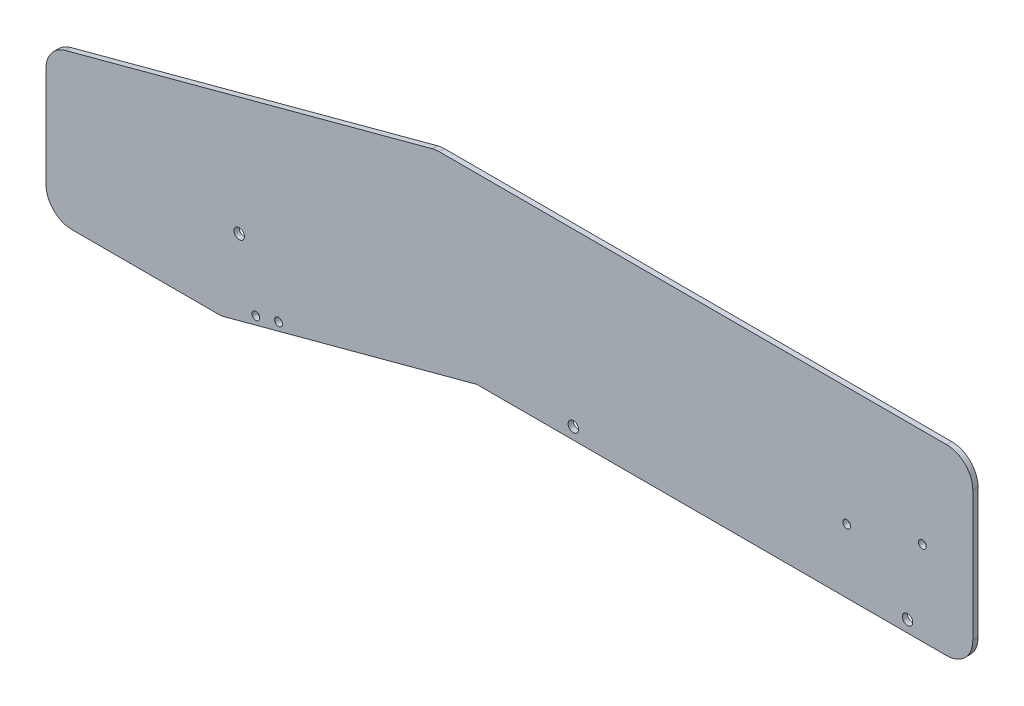
ISO-10303-21;
HEADER;
FILE_DESCRIPTION(('STEP AP214'),'2;1');
FILE_NAME('part.step','',(''),(''),'','','');
FILE_SCHEMA(('AUTOMOTIVE_DESIGN { 1 0 10303 214 1 1 1 1 }'));
ENDSEC;
DATA;
#1=APPLICATION_CONTEXT('core data for automotive mechanical design processes');
#2=APPLICATION_PROTOCOL_DEFINITION('international standard','automotive_design',2000,#1);
#3=PRODUCT_CONTEXT('',#1,'mechanical');
#4=PRODUCT('Part','Part','',(#3));
#5=PRODUCT_RELATED_PRODUCT_CATEGORY('part','',(#4));
#6=PRODUCT_DEFINITION_FORMATION('','',#4);
#7=PRODUCT_DEFINITION_CONTEXT('part definition',#1,'design');
#8=PRODUCT_DEFINITION('design','',#6,#7);
#9=PRODUCT_DEFINITION_SHAPE('','',#8);
#10=(LENGTH_UNIT() NAMED_UNIT(*) SI_UNIT(.MILLI.,.METRE.));
#11=(NAMED_UNIT(*) PLANE_ANGLE_UNIT() SI_UNIT($,.RADIAN.));
#12=(NAMED_UNIT(*) SI_UNIT($,.STERADIAN.) SOLID_ANGLE_UNIT());
#13=UNCERTAINTY_MEASURE_WITH_UNIT(LENGTH_MEASURE(1.E-05),#10,'distance_accuracy_value','');
#14=(GEOMETRIC_REPRESENTATION_CONTEXT(3) GLOBAL_UNCERTAINTY_ASSIGNED_CONTEXT((#13)) GLOBAL_UNIT_ASSIGNED_CONTEXT((#10,
#11,#12)) REPRESENTATION_CONTEXT('',''));
#15=CARTESIAN_POINT('',(0.,0.,0.));
#16=DIRECTION('',(0.,0.,1.));
#17=DIRECTION('',(1.,0.,0.));
#18=AXIS2_PLACEMENT_3D('',#15,#16,#17);
#19=CARTESIAN_POINT('',(-177.5,-35.,2.));
#20=DIRECTION('',(0.,1.,0.));
#21=DIRECTION('',(0.,0.,1.));
#22=AXIS2_PLACEMENT_3D('',#19,#20,#21);
#23=PLANE('',#22);
#24=DIRECTION('',(1.,0.,0.));
#25=VECTOR('',#24,1.);
#26=CARTESIAN_POINT('',(-177.5,-35.,0.));
#27=LINE('',#26,#25);
#28=CARTESIAN_POINT('',(-12.5,-35.,0.));
#29=VERTEX_POINT('',#28);
#30=CARTESIAN_POINT('',(167.5,-35.,0.));
#31=VERTEX_POINT('',#30);
#32=EDGE_CURVE('E173',#29,#31,#27,.T.);
#33=ORIENTED_EDGE('',*,*,#32,.T.);
#34=DIRECTION('',(0.,0.,-1.));
#35=VECTOR('',#34,1.);
#36=CARTESIAN_POINT('',(167.5,-35.,2.));
#37=LINE('',#36,#35);
#38=CARTESIAN_POINT('',(167.5,-35.,2.));
#39=VERTEX_POINT('',#38);
#40=EDGE_CURVE('E248',#31,#39,#37,.F.);
#41=ORIENTED_EDGE('',*,*,#40,.T.);
#42=DIRECTION('',(1.,0.,0.));
#43=VECTOR('',#42,1.);
#44=CARTESIAN_POINT('',(-177.5,-35.,2.));
#45=LINE('',#44,#43);
#46=CARTESIAN_POINT('',(-12.5,-35.,2.));
#47=VERTEX_POINT('',#46);
#48=EDGE_CURVE('E180',#47,#39,#45,.T.);
#49=ORIENTED_EDGE('',*,*,#48,.F.);
#50=DIRECTION('',(0.,0.,1.));
#51=VECTOR('',#50,1.);
#52=CARTESIAN_POINT('',(-12.5,-35.,-170.820569767663));
#53=LINE('',#52,#51);
#54=EDGE_CURVE('E154',#29,#47,#53,.T.);
#55=ORIENTED_EDGE('',*,*,#54,.F.);
#56=EDGE_LOOP('',(#33,#41,#49,#55));
#57=FACE_BOUND('',#56,.T.);
#58=ADVANCED_FACE('F39',(#57),#23,.F.);
#59=CARTESIAN_POINT('',(177.5,35.,2.));
#60=DIRECTION('',(-1.,0.,0.));
#61=DIRECTION('',(0.,0.,1.));
#62=AXIS2_PLACEMENT_3D('',#59,#60,#61);
#63=PLANE('',#62);
#64=DIRECTION('',(0.,1.,0.));
#65=VECTOR('',#64,1.);
#66=CARTESIAN_POINT('',(177.5,35.,0.));
#67=LINE('',#66,#65);
#68=CARTESIAN_POINT('',(177.5,-25.,0.));
#69=VERTEX_POINT('',#68);
#70=CARTESIAN_POINT('',(177.5,25.,0.));
#71=VERTEX_POINT('',#70);
#72=EDGE_CURVE('E184',#69,#71,#67,.T.);
#73=ORIENTED_EDGE('',*,*,#72,.T.);
#74=DIRECTION('',(0.,0.,-1.));
#75=VECTOR('',#74,1.);
#76=CARTESIAN_POINT('',(177.5,25.,2.));
#77=LINE('',#76,#75);
#78=CARTESIAN_POINT('',(177.5,25.,2.));
#79=VERTEX_POINT('',#78);
#80=EDGE_CURVE('E245',#71,#79,#77,.F.);
#81=ORIENTED_EDGE('',*,*,#80,.T.);
#82=DIRECTION('',(0.,1.,0.));
#83=VECTOR('',#82,1.);
#84=CARTESIAN_POINT('',(177.5,35.,2.));
#85=LINE('',#84,#83);
#86=CARTESIAN_POINT('',(177.5,-25.,2.));
#87=VERTEX_POINT('',#86);
#88=EDGE_CURVE('E168',#87,#79,#85,.T.);
#89=ORIENTED_EDGE('',*,*,#88,.F.);
#90=DIRECTION('',(0.,0.,-1.));
#91=VECTOR('',#90,1.);
#92=CARTESIAN_POINT('',(177.5,-25.,2.));
#93=LINE('',#92,#91);
#94=EDGE_CURVE('E241',#87,#69,#93,.T.);
#95=ORIENTED_EDGE('',*,*,#94,.T.);
#96=EDGE_LOOP('',(#73,#81,#89,#95));
#97=FACE_BOUND('',#96,.T.);
#98=ADVANCED_FACE('F280',(#97),#63,.F.);
#99=CARTESIAN_POINT('',(-177.5,35.,2.));
#100=DIRECTION('',(0.,-1.,0.));
#101=DIRECTION('',(0.,0.,-1.));
#102=AXIS2_PLACEMENT_3D('',#99,#100,#101);
#103=PLANE('',#102);
#104=DIRECTION('',(-1.,0.,0.));
#105=VECTOR('',#104,1.);
#106=CARTESIAN_POINT('',(-177.5,35.,2.));
#107=LINE('',#106,#105);
#108=CARTESIAN_POINT('',(167.5,35.,2.));
#109=VERTEX_POINT('',#108);
#110=CARTESIAN_POINT('',(-26.9014427213671,35.,2.));
#111=VERTEX_POINT('',#110);
#112=EDGE_CURVE('E172',#109,#111,#107,.T.);
#113=ORIENTED_EDGE('',*,*,#112,.F.);
#114=DIRECTION('',(0.,0.,-1.));
#115=VECTOR('',#114,1.);
#116=CARTESIAN_POINT('',(167.5,35.,2.));
#117=LINE('',#116,#115);
#118=CARTESIAN_POINT('',(167.5,35.,0.));
#119=VERTEX_POINT('',#118);
#120=EDGE_CURVE('E237',#109,#119,#117,.T.);
#121=ORIENTED_EDGE('',*,*,#120,.T.);
#122=DIRECTION('',(-1.,0.,0.));
#123=VECTOR('',#122,1.);
#124=CARTESIAN_POINT('',(-177.5,35.,0.));
#125=LINE('',#124,#123);
#126=CARTESIAN_POINT('',(-26.9014427213671,35.,0.));
#127=VERTEX_POINT('',#126);
#128=EDGE_CURVE('E187',#119,#127,#125,.T.);
#129=ORIENTED_EDGE('',*,*,#128,.T.);
#130=DIRECTION('',(0.,0.,1.));
#131=VECTOR('',#130,1.);
#132=CARTESIAN_POINT('',(-26.9014427213671,35.,2.));
#133=LINE('',#132,#131);
#134=EDGE_CURVE('E233',#127,#111,#133,.T.);
#135=ORIENTED_EDGE('',*,*,#134,.T.);
#136=EDGE_LOOP('',(#113,#121,#129,#135));
#137=FACE_BOUND('',#136,.T.);
#138=ADVANCED_FACE('F272',(#137),#103,.F.);
#139=CARTESIAN_POINT('',(-177.5,35.,2.));
#140=DIRECTION('',(1.,0.,0.));
#141=DIRECTION('',(0.,0.,-1.));
#142=AXIS2_PLACEMENT_3D('',#139,#140,#141);
#143=PLANE('',#142);
#144=DIRECTION('',(0.,-1.,0.));
#145=VECTOR('',#144,1.);
#146=CARTESIAN_POINT('',(-177.5,35.,0.));
#147=LINE('',#146,#145);
#148=CARTESIAN_POINT('',(-177.5,-12.6732698797897,0.));
#149=VERTEX_POINT('',#148);
#150=CARTESIAN_POINT('',(-177.5,-51.2116167511341,0.));
#151=VERTEX_POINT('',#150);
#152=EDGE_CURVE('E191',#149,#151,#147,.T.);
#153=ORIENTED_EDGE('',*,*,#152,.T.);
#154=DIRECTION('',(0.,0.,1.));
#155=VECTOR('',#154,1.);
#156=CARTESIAN_POINT('',(-177.5,-51.2116167511341,2.));
#157=LINE('',#156,#155);
#158=CARTESIAN_POINT('',(-177.5,-51.2116167511341,2.));
#159=VERTEX_POINT('',#158);
#160=EDGE_CURVE('E199',#151,#159,#157,.T.);
#161=ORIENTED_EDGE('',*,*,#160,.T.);
#162=DIRECTION('',(0.,-1.,0.));
#163=VECTOR('',#162,1.);
#164=CARTESIAN_POINT('',(-177.5,35.,2.));
#165=LINE('',#164,#163);
#166=CARTESIAN_POINT('',(-177.5,-12.6732698797897,2.));
#167=VERTEX_POINT('',#166);
#168=EDGE_CURVE('E177',#167,#159,#165,.T.);
#169=ORIENTED_EDGE('',*,*,#168,.F.);
#170=DIRECTION('',(0.,0.,1.));
#171=VECTOR('',#170,1.);
#172=CARTESIAN_POINT('',(-177.5,-12.6732698797897,2.));
#173=LINE('',#172,#171);
#174=EDGE_CURVE('E183',#167,#149,#173,.F.);
#175=ORIENTED_EDGE('',*,*,#174,.T.);
#176=EDGE_LOOP('',(#153,#161,#169,#175));
#177=FACE_BOUND('',#176,.T.);
#178=ADVANCED_FACE('F296',(#177),#143,.F.);
#179=CARTESIAN_POINT('',(0.,0.,2.));
#180=DIRECTION('',(0.,0.,1.));
#181=DIRECTION('',(1.,0.,0.));
#182=AXIS2_PLACEMENT_3D('',#179,#180,#181);
#183=PLANE('',#182);
#184=ORIENTED_EDGE('',*,*,#168,.T.);
#185=CARTESIAN_POINT('',(-167.5,-51.2116167511341,2.));
#186=DIRECTION('',(0.,0.,1.));
#187=DIRECTION('',(1.,0.,0.));
#188=AXIS2_PLACEMENT_3D('',#185,#186,#187);
#189=CIRCLE('',#188,10.);
#190=CARTESIAN_POINT('',(-167.5,-61.2116167511341,2.));
#191=VERTEX_POINT('',#190);
#192=EDGE_CURVE('E149',#159,#191,#189,.T.);
#193=ORIENTED_EDGE('',*,*,#192,.T.);
#194=DIRECTION('',(-1.,0.,0.));
#195=VECTOR('',#194,1.);
#196=CARTESIAN_POINT('',(-110.323085463758,-61.2116167511341,2.));
#197=LINE('',#196,#195);
#198=CARTESIAN_POINT('',(-110.323085463758,-61.2116167511341,2.));
#199=VERTEX_POINT('',#198);
#200=EDGE_CURVE('E132',#199,#191,#197,.T.);
#201=ORIENTED_EDGE('',*,*,#200,.F.);
#202=DIRECTION('',(0.96592582628907,0.258819045102515,0.));
#203=VECTOR('',#202,1.);
#204=CARTESIAN_POINT('',(-12.5,-35.,2.));
#205=LINE('',#204,#203);
#206=EDGE_CURVE('E147',#199,#47,#205,.T.);
#207=ORIENTED_EDGE('',*,*,#206,.T.);
#208=ORIENTED_EDGE('',*,*,#48,.T.);
#209=CARTESIAN_POINT('',(167.5,-25.,2.));
#210=DIRECTION('',(0.,0.,1.));
#211=DIRECTION('',(1.,0.,0.));
#212=AXIS2_PLACEMENT_3D('',#209,#210,#211);
#213=CIRCLE('',#212,10.);
#214=EDGE_CURVE('E209',#39,#87,#213,.T.);
#215=ORIENTED_EDGE('',*,*,#214,.T.);
#216=ORIENTED_EDGE('',*,*,#88,.T.);
#217=CARTESIAN_POINT('',(167.5,25.,2.));
#218=DIRECTION('',(0.,0.,1.));
#219=DIRECTION('',(1.,0.,0.));
#220=AXIS2_PLACEMENT_3D('',#217,#218,#219);
#221=CIRCLE('',#220,10.);
#222=EDGE_CURVE('E212',#79,#109,#221,.T.);
#223=ORIENTED_EDGE('',*,*,#222,.T.);
#224=ORIENTED_EDGE('',*,*,#112,.T.);
#225=CARTESIAN_POINT('',(-26.9014427213671,25.,2.));
#226=DIRECTION('',(0.,0.,1.));
#227=DIRECTION('',(1.,0.,0.));
#228=AXIS2_PLACEMENT_3D('',#225,#226,#227);
#229=CIRCLE('',#228,10.);
#230=CARTESIAN_POINT('',(-29.4896331723923,34.6592582628907,2.));
#231=VERTEX_POINT('',#230);
#232=EDGE_CURVE('E203',#111,#231,#229,.T.);
#233=ORIENTED_EDGE('',*,*,#232,.T.);
#234=DIRECTION('',(0.96592582628907,0.258819045102515,0.));
#235=VECTOR('',#234,1.);
#236=CARTESIAN_POINT('',(-177.5,-5.,2.));
#237=LINE('',#236,#235);
#238=CARTESIAN_POINT('',(-170.088190451025,-3.01401161689895,2.));
#239=VERTEX_POINT('',#238);
#240=EDGE_CURVE('E260',#239,#231,#237,.T.);
#241=ORIENTED_EDGE('',*,*,#240,.F.);
#242=CARTESIAN_POINT('',(-167.5,-12.6732698797897,2.));
#243=DIRECTION('',(0.,0.,1.));
#244=DIRECTION('',(1.,0.,0.));
#245=AXIS2_PLACEMENT_3D('',#242,#243,#244);
#246=CIRCLE('',#245,10.);
#247=EDGE_CURVE('E206',#239,#167,#246,.T.);
#248=ORIENTED_EDGE('',*,*,#247,.T.);
#249=EDGE_LOOP('',(#184,#193,#201,#207,#208,#215,#216,#223,#224,#233,#241,#248));
#250=FACE_BOUND('',#249,.T.);
#251=CARTESIAN_POINT('',(-97.1275124741684,-54.570045083678,2.));
#252=DIRECTION('',(0.,0.,1.));
#253=DIRECTION('',(1.,0.,0.));
#254=AXIS2_PLACEMENT_3D('',#251,#252,#253);
#255=CIRCLE('',#254,1.5);
#256=CARTESIAN_POINT('',(-95.6275124741684,-54.570045083678,2.));
#257=VERTEX_POINT('',#256);
#258=EDGE_CURVE('E547',#257,#257,#255,.T.);
#259=ORIENTED_EDGE('',*,*,#258,.F.);
#260=EDGE_LOOP('',(#259));
#261=FACE_BOUND('',#260,.T.);
#262=CARTESIAN_POINT('',(-88.4341800375668,-52.2406736777553,2.));
#263=DIRECTION('',(0.,0.,1.));
#264=DIRECTION('',(1.,0.,0.));
#265=AXIS2_PLACEMENT_3D('',#262,#263,#264);
#266=CIRCLE('',#265,1.5);
#267=CARTESIAN_POINT('',(-86.9341800375668,-52.2406736777553,2.));
#268=VERTEX_POINT('',#267);
#269=EDGE_CURVE('E543',#268,#268,#266,.T.);
#270=ORIENTED_EDGE('',*,*,#269,.F.);
#271=EDGE_LOOP('',(#270));
#272=FACE_BOUND('',#271,.T.);
#273=CARTESIAN_POINT('',(129.203708685547,-10.4891960385437,2.));
#274=DIRECTION('',(0.,0.,1.));
#275=DIRECTION('',(1.,0.,0.));
#276=AXIS2_PLACEMENT_3D('',#273,#274,#275);
#277=CIRCLE('',#276,1.49999999999962);
#278=CARTESIAN_POINT('',(130.703708685546,-10.4891960385437,2.));
#279=VERTEX_POINT('',#278);
#280=EDGE_CURVE('E537',#279,#279,#277,.T.);
#281=ORIENTED_EDGE('',*,*,#280,.F.);
#282=EDGE_LOOP('',(#281));
#283=FACE_BOUND('',#282,.T.);
#284=CARTESIAN_POINT('',(158.181483474219,-2.72462468546804,2.));
#285=DIRECTION('',(0.,0.,1.));
#286=DIRECTION('',(1.,0.,0.));
#287=AXIS2_PLACEMENT_3D('',#284,#285,#286);
#288=CIRCLE('',#287,1.49999999999962);
#289=CARTESIAN_POINT('',(159.681483474218,-2.72462468546804,2.));
#290=VERTEX_POINT('',#289);
#291=EDGE_CURVE('E531',#290,#290,#288,.T.);
#292=ORIENTED_EDGE('',*,*,#291,.F.);
#293=EDGE_LOOP('',(#292));
#294=FACE_BOUND('',#293,.T.);
#295=CARTESIAN_POINT('',(152.5,-30.5,2.));
#296=DIRECTION('',(0.,0.,1.));
#297=DIRECTION('',(1.,0.,0.));
#298=AXIS2_PLACEMENT_3D('',#295,#296,#297);
#299=CIRCLE('',#298,2.);
#300=CARTESIAN_POINT('',(154.5,-30.5,2.));
#301=VERTEX_POINT('',#300);
#302=EDGE_CURVE('E163',#301,#301,#299,.T.);
#303=ORIENTED_EDGE('',*,*,#302,.F.);
#304=EDGE_LOOP('',(#303));
#305=FACE_BOUND('',#304,.T.);
#306=CARTESIAN_POINT('',(24.5,-30.5,2.));
#307=DIRECTION('',(0.,0.,1.));
#308=DIRECTION('',(1.,0.,0.));
#309=AXIS2_PLACEMENT_3D('',#306,#307,#308);
#310=CIRCLE('',#309,2.);
#311=CARTESIAN_POINT('',(26.5,-30.5,2.));
#312=VERTEX_POINT('',#311);
#313=EDGE_CURVE('E515',#312,#312,#310,.T.);
#314=ORIENTED_EDGE('',*,*,#313,.F.);
#315=EDGE_LOOP('',(#314));
#316=FACE_BOUND('',#315,.T.);
#317=CARTESIAN_POINT('',(-103.5,-30.5,2.));
#318=DIRECTION('',(0.,0.,1.));
#319=DIRECTION('',(1.,0.,0.));
#320=AXIS2_PLACEMENT_3D('',#317,#318,#319);
#321=CIRCLE('',#320,2.);
#322=CARTESIAN_POINT('',(-101.5,-30.5,2.));
#323=VERTEX_POINT('',#322);
#324=EDGE_CURVE('E516',#323,#323,#321,.T.);
#325=ORIENTED_EDGE('',*,*,#324,.F.);
#326=EDGE_LOOP('',(#325));
#327=FACE_BOUND('',#326,.T.);
#328=ADVANCED_FACE('F144',(#250,#261,#272,#283,#294,#305,#316,#327),#183,.T.);
#329=CARTESIAN_POINT('',(0.,0.,0.));
#330=DIRECTION('',(0.,0.,1.));
#331=DIRECTION('',(1.,0.,0.));
#332=AXIS2_PLACEMENT_3D('',#329,#330,#331);
#333=PLANE('',#332);
#334=CARTESIAN_POINT('',(-97.1275124741684,-54.570045083678,0.));
#335=DIRECTION('',(0.,0.,1.));
#336=DIRECTION('',(1.,0.,0.));
#337=AXIS2_PLACEMENT_3D('',#334,#335,#336);
#338=CIRCLE('',#337,1.5);
#339=CARTESIAN_POINT('',(-95.6275124741684,-54.570045083678,0.));
#340=VERTEX_POINT('',#339);
#341=EDGE_CURVE('E493',#340,#340,#338,.T.);
#342=ORIENTED_EDGE('',*,*,#341,.T.);
#343=EDGE_LOOP('',(#342));
#344=FACE_BOUND('',#343,.T.);
#345=CARTESIAN_POINT('',(-88.4341800375668,-52.2406736777553,0.));
#346=DIRECTION('',(0.,0.,1.));
#347=DIRECTION('',(1.,0.,0.));
#348=AXIS2_PLACEMENT_3D('',#345,#346,#347);
#349=CIRCLE('',#348,1.5);
#350=CARTESIAN_POINT('',(-86.9341800375668,-52.2406736777553,0.));
#351=VERTEX_POINT('',#350);
#352=EDGE_CURVE('E497',#351,#351,#349,.T.);
#353=ORIENTED_EDGE('',*,*,#352,.T.);
#354=EDGE_LOOP('',(#353));
#355=FACE_BOUND('',#354,.T.);
#356=CARTESIAN_POINT('',(129.203708685547,-10.4891960385437,0.));
#357=DIRECTION('',(0.,0.,1.));
#358=DIRECTION('',(1.,0.,0.));
#359=AXIS2_PLACEMENT_3D('',#356,#357,#358);
#360=CIRCLE('',#359,1.49999999999962);
#361=CARTESIAN_POINT('',(130.703708685546,-10.4891960385437,0.));
#362=VERTEX_POINT('',#361);
#363=EDGE_CURVE('E501',#362,#362,#360,.T.);
#364=ORIENTED_EDGE('',*,*,#363,.T.);
#365=EDGE_LOOP('',(#364));
#366=FACE_BOUND('',#365,.T.);
#367=CARTESIAN_POINT('',(158.181483474219,-2.72462468546804,0.));
#368=DIRECTION('',(0.,0.,1.));
#369=DIRECTION('',(1.,0.,0.));
#370=AXIS2_PLACEMENT_3D('',#367,#368,#369);
#371=CIRCLE('',#370,1.49999999999962);
#372=CARTESIAN_POINT('',(159.681483474218,-2.72462468546804,0.));
#373=VERTEX_POINT('',#372);
#374=EDGE_CURVE('E267',#373,#373,#371,.T.);
#375=ORIENTED_EDGE('',*,*,#374,.T.);
#376=EDGE_LOOP('',(#375));
#377=FACE_BOUND('',#376,.T.);
#378=CARTESIAN_POINT('',(152.5,-30.5,0.));
#379=DIRECTION('',(0.,0.,1.));
#380=DIRECTION('',(1.,0.,0.));
#381=AXIS2_PLACEMENT_3D('',#378,#379,#380);
#382=CIRCLE('',#381,2.);
#383=CARTESIAN_POINT('',(154.5,-30.5,0.));
#384=VERTEX_POINT('',#383);
#385=EDGE_CURVE('E156',#384,#384,#382,.T.);
#386=ORIENTED_EDGE('',*,*,#385,.T.);
#387=EDGE_LOOP('',(#386));
#388=FACE_BOUND('',#387,.T.);
#389=CARTESIAN_POINT('',(24.5,-30.5,0.));
#390=DIRECTION('',(0.,0.,1.));
#391=DIRECTION('',(1.,0.,0.));
#392=AXIS2_PLACEMENT_3D('',#389,#390,#391);
#393=CIRCLE('',#392,2.);
#394=CARTESIAN_POINT('',(26.5,-30.5,0.));
#395=VERTEX_POINT('',#394);
#396=EDGE_CURVE('E510',#395,#395,#393,.T.);
#397=ORIENTED_EDGE('',*,*,#396,.T.);
#398=EDGE_LOOP('',(#397));
#399=FACE_BOUND('',#398,.T.);
#400=CARTESIAN_POINT('',(-103.5,-30.5,0.));
#401=DIRECTION('',(0.,0.,1.));
#402=DIRECTION('',(1.,0.,0.));
#403=AXIS2_PLACEMENT_3D('',#400,#401,#402);
#404=CIRCLE('',#403,2.);
#405=CARTESIAN_POINT('',(-101.5,-30.5,0.));
#406=VERTEX_POINT('',#405);
#407=EDGE_CURVE('E513',#406,#406,#404,.T.);
#408=ORIENTED_EDGE('',*,*,#407,.T.);
#409=EDGE_LOOP('',(#408));
#410=FACE_BOUND('',#409,.T.);
#411=DIRECTION('',(1.,0.,0.));
#412=VECTOR('',#411,1.);
#413=CARTESIAN_POINT('',(-110.323085463758,-61.2116167511341,0.));
#414=LINE('',#413,#412);
#415=CARTESIAN_POINT('',(-167.5,-61.2116167511341,0.));
#416=VERTEX_POINT('',#415);
#417=CARTESIAN_POINT('',(-110.323085463758,-61.2116167511341,0.));
#418=VERTEX_POINT('',#417);
#419=EDGE_CURVE('E135',#416,#418,#414,.T.);
#420=ORIENTED_EDGE('',*,*,#419,.F.);
#421=CARTESIAN_POINT('',(-167.5,-51.2116167511341,0.));
#422=DIRECTION('',(0.,0.,1.));
#423=DIRECTION('',(1.,0.,0.));
#424=AXIS2_PLACEMENT_3D('',#421,#422,#423);
#425=CIRCLE('',#424,10.);
#426=EDGE_CURVE('E230',#416,#151,#425,.F.);
#427=ORIENTED_EDGE('',*,*,#426,.T.);
#428=ORIENTED_EDGE('',*,*,#152,.F.);
#429=CARTESIAN_POINT('',(-167.5,-12.6732698797897,0.));
#430=DIRECTION('',(0.,0.,1.));
#431=DIRECTION('',(1.,0.,0.));
#432=AXIS2_PLACEMENT_3D('',#429,#430,#431);
#433=CIRCLE('',#432,10.);
#434=CARTESIAN_POINT('',(-170.088190451025,-3.01401161689895,0.));
#435=VERTEX_POINT('',#434);
#436=EDGE_CURVE('E223',#149,#435,#433,.F.);
#437=ORIENTED_EDGE('',*,*,#436,.T.);
#438=DIRECTION('',(-0.96592582628907,-0.258819045102515,0.));
#439=VECTOR('',#438,1.);
#440=CARTESIAN_POINT('',(-177.5,-5.,0.));
#441=LINE('',#440,#439);
#442=CARTESIAN_POINT('',(-29.4896331723923,34.6592582628907,0.));
#443=VERTEX_POINT('',#442);
#444=EDGE_CURVE('E257',#443,#435,#441,.T.);
#445=ORIENTED_EDGE('',*,*,#444,.F.);
#446=CARTESIAN_POINT('',(-26.9014427213671,25.,0.));
#447=DIRECTION('',(0.,0.,1.));
#448=DIRECTION('',(1.,0.,0.));
#449=AXIS2_PLACEMENT_3D('',#446,#447,#448);
#450=CIRCLE('',#449,10.);
#451=EDGE_CURVE('E220',#443,#127,#450,.F.);
#452=ORIENTED_EDGE('',*,*,#451,.T.);
#453=ORIENTED_EDGE('',*,*,#128,.F.);
#454=CARTESIAN_POINT('',(167.5,25.,0.));
#455=DIRECTION('',(0.,0.,1.));
#456=DIRECTION('',(1.,0.,0.));
#457=AXIS2_PLACEMENT_3D('',#454,#455,#456);
#458=CIRCLE('',#457,10.);
#459=EDGE_CURVE('E61',#119,#71,#458,.F.);
#460=ORIENTED_EDGE('',*,*,#459,.T.);
#461=ORIENTED_EDGE('',*,*,#72,.F.);
#462=CARTESIAN_POINT('',(167.5,-25.,0.));
#463=DIRECTION('',(0.,0.,1.));
#464=DIRECTION('',(1.,0.,0.));
#465=AXIS2_PLACEMENT_3D('',#462,#463,#464);
#466=CIRCLE('',#465,10.);
#467=EDGE_CURVE('E55',#69,#31,#466,.F.);
#468=ORIENTED_EDGE('',*,*,#467,.T.);
#469=ORIENTED_EDGE('',*,*,#32,.F.);
#470=DIRECTION('',(-0.96592582628907,-0.258819045102515,0.));
#471=VECTOR('',#470,1.);
#472=CARTESIAN_POINT('',(-12.5,-35.,0.));
#473=LINE('',#472,#471);
#474=EDGE_CURVE('E160',#29,#418,#473,.T.);
#475=ORIENTED_EDGE('',*,*,#474,.T.);
#476=EDGE_LOOP('',(#420,#427,#428,#437,#445,#452,#453,#460,#461,#468,#469,#475));
#477=FACE_BOUND('',#476,.T.);
#478=ADVANCED_FACE('F263',(#344,#355,#366,#377,#388,#399,#410,#477),#333,.F.);
#479=CARTESIAN_POINT('',(-12.5,-35.,-170.820569767663));
#480=DIRECTION('',(0.258819045102515,-0.96592582628907,0.));
#481=DIRECTION('',(0.96592582628907,0.258819045102515,0.));
#482=AXIS2_PLACEMENT_3D('',#479,#480,#481);
#483=PLANE('',#482);
#484=DIRECTION('',(0.,0.,1.));
#485=VECTOR('',#484,1.);
#486=CARTESIAN_POINT('',(-110.323085463758,-61.2116167511341,-69.5466594928146));
#487=LINE('',#486,#485);
#488=EDGE_CURVE('E129',#418,#199,#487,.T.);
#489=ORIENTED_EDGE('',*,*,#488,.F.);
#490=ORIENTED_EDGE('',*,*,#474,.F.);
#491=ORIENTED_EDGE('',*,*,#54,.T.);
#492=ORIENTED_EDGE('',*,*,#206,.F.);
#493=EDGE_LOOP('',(#489,#490,#491,#492));
#494=FACE_BOUND('',#493,.T.);
#495=ADVANCED_FACE('F153',(#494),#483,.T.);
#496=CARTESIAN_POINT('',(-103.5,-30.5,0.));
#497=DIRECTION('',(0.,0.,1.));
#498=DIRECTION('',(1.,0.,0.));
#499=AXIS2_PLACEMENT_3D('',#496,#497,#498);
#500=CYLINDRICAL_SURFACE('',#499,2.);
#501=ORIENTED_EDGE('',*,*,#407,.F.);
#502=EDGE_LOOP('',(#501));
#503=FACE_BOUND('',#502,.T.);
#504=ORIENTED_EDGE('',*,*,#324,.T.);
#505=EDGE_LOOP('',(#504));
#506=FACE_BOUND('',#505,.T.);
#507=ADVANCED_FACE('F418',(#503,#506),#500,.F.);
#508=CARTESIAN_POINT('',(24.5,-30.5,0.));
#509=DIRECTION('',(0.,0.,1.));
#510=DIRECTION('',(1.,0.,0.));
#511=AXIS2_PLACEMENT_3D('',#508,#509,#510);
#512=CYLINDRICAL_SURFACE('',#511,2.);
#513=ORIENTED_EDGE('',*,*,#396,.F.);
#514=EDGE_LOOP('',(#513));
#515=FACE_BOUND('',#514,.T.);
#516=ORIENTED_EDGE('',*,*,#313,.T.);
#517=EDGE_LOOP('',(#516));
#518=FACE_BOUND('',#517,.T.);
#519=ADVANCED_FACE('F409',(#515,#518),#512,.F.);
#520=CARTESIAN_POINT('',(152.5,-30.5,0.));
#521=DIRECTION('',(0.,0.,1.));
#522=DIRECTION('',(1.,0.,0.));
#523=AXIS2_PLACEMENT_3D('',#520,#521,#522);
#524=CYLINDRICAL_SURFACE('',#523,2.);
#525=ORIENTED_EDGE('',*,*,#385,.F.);
#526=EDGE_LOOP('',(#525));
#527=FACE_BOUND('',#526,.T.);
#528=ORIENTED_EDGE('',*,*,#302,.T.);
#529=EDGE_LOOP('',(#528));
#530=FACE_BOUND('',#529,.T.);
#531=ADVANCED_FACE('F400',(#527,#530),#524,.F.);
#532=CARTESIAN_POINT('',(158.181483474219,-2.72462468546804,0.));
#533=DIRECTION('',(0.,0.,1.));
#534=DIRECTION('',(1.,0.,0.));
#535=AXIS2_PLACEMENT_3D('',#532,#533,#534);
#536=CYLINDRICAL_SURFACE('',#535,1.49999999999962);
#537=ORIENTED_EDGE('',*,*,#374,.F.);
#538=EDGE_LOOP('',(#537));
#539=FACE_BOUND('',#538,.T.);
#540=ORIENTED_EDGE('',*,*,#291,.T.);
#541=EDGE_LOOP('',(#540));
#542=FACE_BOUND('',#541,.T.);
#543=ADVANCED_FACE('F391',(#539,#542),#536,.F.);
#544=CARTESIAN_POINT('',(129.203708685547,-10.4891960385437,0.));
#545=DIRECTION('',(0.,0.,1.));
#546=DIRECTION('',(1.,0.,0.));
#547=AXIS2_PLACEMENT_3D('',#544,#545,#546);
#548=CYLINDRICAL_SURFACE('',#547,1.49999999999962);
#549=ORIENTED_EDGE('',*,*,#363,.F.);
#550=EDGE_LOOP('',(#549));
#551=FACE_BOUND('',#550,.T.);
#552=ORIENTED_EDGE('',*,*,#280,.T.);
#553=EDGE_LOOP('',(#552));
#554=FACE_BOUND('',#553,.T.);
#555=ADVANCED_FACE('F382',(#551,#554),#548,.F.);
#556=CARTESIAN_POINT('',(-88.4341800375668,-52.2406736777553,0.));
#557=DIRECTION('',(0.,0.,1.));
#558=DIRECTION('',(1.,0.,0.));
#559=AXIS2_PLACEMENT_3D('',#556,#557,#558);
#560=CYLINDRICAL_SURFACE('',#559,1.5);
#561=ORIENTED_EDGE('',*,*,#352,.F.);
#562=EDGE_LOOP('',(#561));
#563=FACE_BOUND('',#562,.T.);
#564=ORIENTED_EDGE('',*,*,#269,.T.);
#565=EDGE_LOOP('',(#564));
#566=FACE_BOUND('',#565,.T.);
#567=ADVANCED_FACE('F372',(#563,#566),#560,.F.);
#568=CARTESIAN_POINT('',(-97.1275124741684,-54.570045083678,0.));
#569=DIRECTION('',(0.,0.,1.));
#570=DIRECTION('',(1.,0.,0.));
#571=AXIS2_PLACEMENT_3D('',#568,#569,#570);
#572=CYLINDRICAL_SURFACE('',#571,1.5);
#573=ORIENTED_EDGE('',*,*,#341,.F.);
#574=EDGE_LOOP('',(#573));
#575=FACE_BOUND('',#574,.T.);
#576=ORIENTED_EDGE('',*,*,#258,.T.);
#577=EDGE_LOOP('',(#576));
#578=FACE_BOUND('',#577,.T.);
#579=ADVANCED_FACE('F363',(#575,#578),#572,.F.);
#580=CARTESIAN_POINT('',(-177.5,-5.,-154.548132206255));
#581=DIRECTION('',(0.258819045102515,-0.96592582628907,0.));
#582=DIRECTION('',(0.96592582628907,0.258819045102515,0.));
#583=AXIS2_PLACEMENT_3D('',#580,#581,#582);
#584=PLANE('',#583);
#585=ORIENTED_EDGE('',*,*,#444,.T.);
#586=DIRECTION('',(0.,0.,1.));
#587=VECTOR('',#586,1.);
#588=CARTESIAN_POINT('',(-170.088190451025,-3.01401161689895,-154.548132206255));
#589=LINE('',#588,#587);
#590=EDGE_CURVE('E11',#435,#239,#589,.T.);
#591=ORIENTED_EDGE('',*,*,#590,.T.);
#592=ORIENTED_EDGE('',*,*,#240,.T.);
#593=DIRECTION('',(0.,0.,1.));
#594=VECTOR('',#593,1.);
#595=CARTESIAN_POINT('',(-29.4896331723923,34.6592582628907,-154.548132206255));
#596=LINE('',#595,#594);
#597=EDGE_CURVE('E48',#231,#443,#596,.F.);
#598=ORIENTED_EDGE('',*,*,#597,.T.);
#599=EDGE_LOOP('',(#585,#591,#592,#598));
#600=FACE_BOUND('',#599,.T.);
#601=ADVANCED_FACE('F256',(#600),#584,.F.);
#602=CARTESIAN_POINT('',(-110.323085463758,-61.2116167511341,-69.5466594928146));
#603=DIRECTION('',(0.,1.,0.));
#604=DIRECTION('',(-1.,0.,0.));
#605=AXIS2_PLACEMENT_3D('',#602,#603,#604);
#606=PLANE('',#605);
#607=ORIENTED_EDGE('',*,*,#200,.T.);
#608=DIRECTION('',(0.,0.,1.));
#609=VECTOR('',#608,1.);
#610=CARTESIAN_POINT('',(-167.5,-61.2116167511341,-69.5466594928146));
#611=LINE('',#610,#609);
#612=EDGE_CURVE('E217',#191,#416,#611,.F.);
#613=ORIENTED_EDGE('',*,*,#612,.T.);
#614=ORIENTED_EDGE('',*,*,#419,.T.);
#615=ORIENTED_EDGE('',*,*,#488,.T.);
#616=EDGE_LOOP('',(#607,#613,#614,#615));
#617=FACE_BOUND('',#616,.T.);
#618=ADVANCED_FACE('F131',(#617),#606,.F.);
#619=CARTESIAN_POINT('',(-167.5,-51.2116167511341,2.));
#620=DIRECTION('',(0.,0.,1.));
#621=DIRECTION('',(1.,0.,0.));
#622=AXIS2_PLACEMENT_3D('',#619,#620,#621);
#623=CYLINDRICAL_SURFACE('',#622,10.);
#624=ORIENTED_EDGE('',*,*,#426,.F.);
#625=ORIENTED_EDGE('',*,*,#612,.F.);
#626=ORIENTED_EDGE('',*,*,#192,.F.);
#627=ORIENTED_EDGE('',*,*,#160,.F.);
#628=EDGE_LOOP('',(#624,#625,#626,#627));
#629=FACE_BOUND('',#628,.T.);
#630=ADVANCED_FACE('F293',(#629),#623,.T.);
#631=CARTESIAN_POINT('',(167.5,25.,2.));
#632=DIRECTION('',(0.,0.,-1.));
#633=DIRECTION('',(-1.,0.,0.));
#634=AXIS2_PLACEMENT_3D('',#631,#632,#633);
#635=CYLINDRICAL_SURFACE('',#634,10.);
#636=ORIENTED_EDGE('',*,*,#222,.F.);
#637=ORIENTED_EDGE('',*,*,#80,.F.);
#638=ORIENTED_EDGE('',*,*,#459,.F.);
#639=ORIENTED_EDGE('',*,*,#120,.F.);
#640=EDGE_LOOP('',(#636,#637,#638,#639));
#641=FACE_BOUND('',#640,.T.);
#642=ADVANCED_FACE('F278',(#641),#635,.T.);
#643=CARTESIAN_POINT('',(167.5,-25.,2.));
#644=DIRECTION('',(0.,0.,-1.));
#645=DIRECTION('',(-1.,0.,0.));
#646=AXIS2_PLACEMENT_3D('',#643,#644,#645);
#647=CYLINDRICAL_SURFACE('',#646,10.);
#648=ORIENTED_EDGE('',*,*,#214,.F.);
#649=ORIENTED_EDGE('',*,*,#40,.F.);
#650=ORIENTED_EDGE('',*,*,#467,.F.);
#651=ORIENTED_EDGE('',*,*,#94,.F.);
#652=EDGE_LOOP('',(#648,#649,#650,#651));
#653=FACE_BOUND('',#652,.T.);
#654=ADVANCED_FACE('F284',(#653),#647,.T.);
#655=CARTESIAN_POINT('',(-167.5,-12.6732698797897,-154.548132206255));
#656=DIRECTION('',(0.,0.,1.));
#657=DIRECTION('',(1.,0.,0.));
#658=AXIS2_PLACEMENT_3D('',#655,#656,#657);
#659=CYLINDRICAL_SURFACE('',#658,10.);
#660=ORIENTED_EDGE('',*,*,#436,.F.);
#661=ORIENTED_EDGE('',*,*,#174,.F.);
#662=ORIENTED_EDGE('',*,*,#247,.F.);
#663=ORIENTED_EDGE('',*,*,#590,.F.);
#664=EDGE_LOOP('',(#660,#661,#662,#663));
#665=FACE_BOUND('',#664,.T.);
#666=ADVANCED_FACE('F299',(#665),#659,.T.);
#667=CARTESIAN_POINT('',(-26.9014427213671,25.,2.));
#668=DIRECTION('',(0.,0.,1.));
#669=DIRECTION('',(1.,0.,0.));
#670=AXIS2_PLACEMENT_3D('',#667,#668,#669);
#671=CYLINDRICAL_SURFACE('',#670,10.);
#672=ORIENTED_EDGE('',*,*,#451,.F.);
#673=ORIENTED_EDGE('',*,*,#597,.F.);
#674=ORIENTED_EDGE('',*,*,#232,.F.);
#675=ORIENTED_EDGE('',*,*,#134,.F.);
#676=EDGE_LOOP('',(#672,#673,#674,#675));
#677=FACE_BOUND('',#676,.T.);
#678=ADVANCED_FACE('F41',(#677),#671,.T.);
#679=CLOSED_SHELL('',(#58,#98,#138,#178,#328,#478,#495,#507,#519,#531,#543,#555,#567,#579,#601,
#618,#630,#642,#654,#666,#678));
#680=MANIFOLD_SOLID_BREP('B2',#679);
#681=ADVANCED_BREP_SHAPE_REPRESENTATION('',(#18,#680),#14);
#682=SHAPE_DEFINITION_REPRESENTATION(#9,#681);
ENDSEC;
END-ISO-10303-21;
